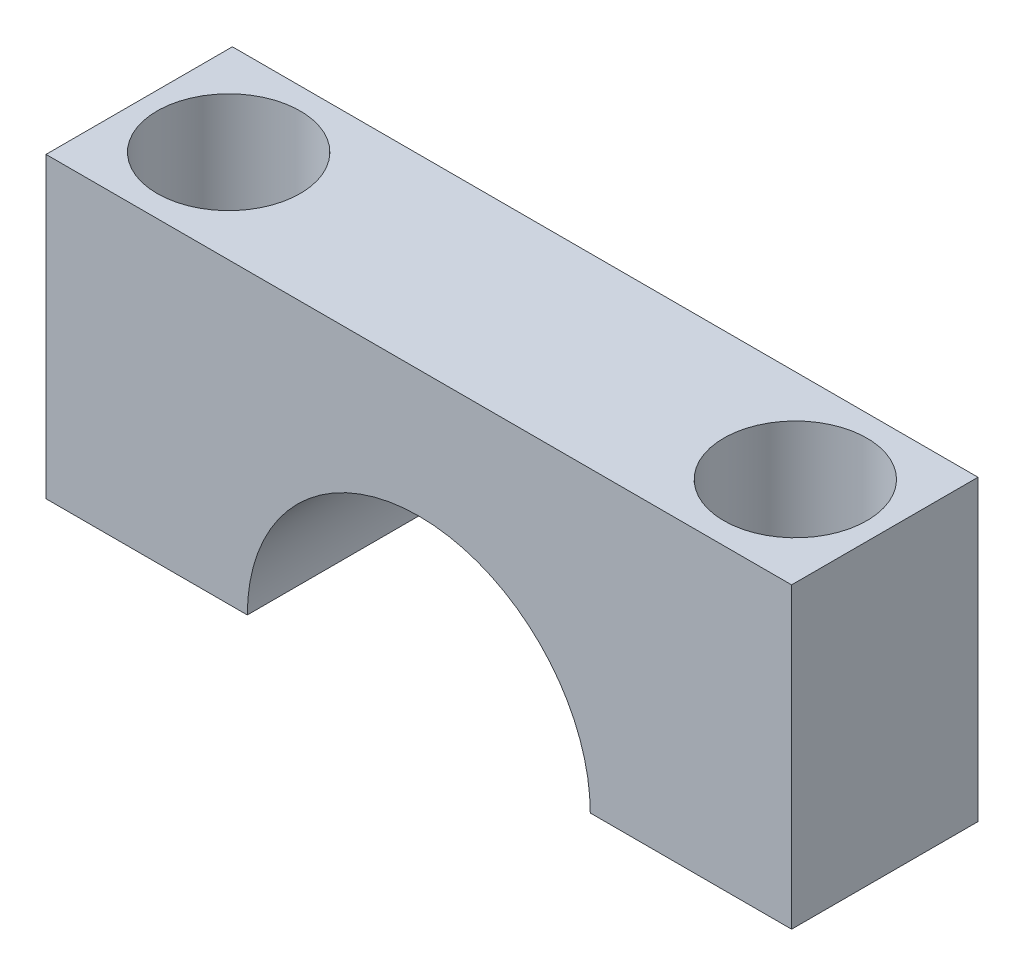
ISO-10303-21;
HEADER;
FILE_DESCRIPTION(('STEP AP214'),'2;1');
FILE_NAME('part.step','',(''),(''),'','','');
FILE_SCHEMA(('AUTOMOTIVE_DESIGN { 1 0 10303 214 1 1 1 1 }'));
ENDSEC;
DATA;
#1=APPLICATION_CONTEXT('core data for automotive mechanical design processes');
#2=APPLICATION_PROTOCOL_DEFINITION('international standard','automotive_design',2000,#1);
#3=PRODUCT_CONTEXT('',#1,'mechanical');
#4=PRODUCT('Part','Part','',(#3));
#5=PRODUCT_RELATED_PRODUCT_CATEGORY('part','',(#4));
#6=PRODUCT_DEFINITION_FORMATION('','',#4);
#7=PRODUCT_DEFINITION_CONTEXT('part definition',#1,'design');
#8=PRODUCT_DEFINITION('design','',#6,#7);
#9=PRODUCT_DEFINITION_SHAPE('','',#8);
#10=(LENGTH_UNIT() NAMED_UNIT(*) SI_UNIT(.MILLI.,.METRE.));
#11=(NAMED_UNIT(*) PLANE_ANGLE_UNIT() SI_UNIT($,.RADIAN.));
#12=(NAMED_UNIT(*) SI_UNIT($,.STERADIAN.) SOLID_ANGLE_UNIT());
#13=UNCERTAINTY_MEASURE_WITH_UNIT(LENGTH_MEASURE(1.E-05),#10,'distance_accuracy_value','');
#14=(GEOMETRIC_REPRESENTATION_CONTEXT(3) GLOBAL_UNCERTAINTY_ASSIGNED_CONTEXT((#13)) GLOBAL_UNIT_ASSIGNED_CONTEXT((#10,
#11,#12)) REPRESENTATION_CONTEXT('',''));
#15=CARTESIAN_POINT('',(0.,0.,0.));
#16=DIRECTION('',(0.,0.,1.));
#17=DIRECTION('',(1.,0.,0.));
#18=AXIS2_PLACEMENT_3D('',#15,#16,#17);
#19=CARTESIAN_POINT('',(6.35,0.,3.175));
#20=DIRECTION('',(0.,0.,-1.));
#21=DIRECTION('',(-1.,0.,0.));
#22=AXIS2_PLACEMENT_3D('',#19,#20,#21);
#23=CYLINDRICAL_SURFACE('',#22,2.921);
#24=CARTESIAN_POINT('',(6.35,0.,0.));
#25=DIRECTION('',(0.,0.,-1.));
#26=DIRECTION('',(1.,0.,0.));
#27=AXIS2_PLACEMENT_3D('',#24,#25,#26);
#28=CIRCLE('',#27,2.921);
#29=CARTESIAN_POINT('',(3.429,0.,0.));
#30=VERTEX_POINT('',#29);
#31=CARTESIAN_POINT('',(9.271,0.,0.));
#32=VERTEX_POINT('',#31);
#33=EDGE_CURVE('E121',#30,#32,#28,.T.);
#34=ORIENTED_EDGE('',*,*,#33,.T.);
#35=DIRECTION('',(0.,0.,-1.));
#36=VECTOR('',#35,1.);
#37=CARTESIAN_POINT('',(9.271,0.,3.175));
#38=LINE('',#37,#36);
#39=CARTESIAN_POINT('',(9.271,0.,3.175));
#40=VERTEX_POINT('',#39);
#41=EDGE_CURVE('E11',#40,#32,#38,.T.);
#42=ORIENTED_EDGE('',*,*,#41,.F.);
#43=CARTESIAN_POINT('',(6.35,0.,3.175));
#44=DIRECTION('',(0.,0.,-1.));
#45=DIRECTION('',(1.,0.,0.));
#46=AXIS2_PLACEMENT_3D('',#43,#44,#45);
#47=CIRCLE('',#46,2.921);
#48=CARTESIAN_POINT('',(3.429,0.,3.175));
#49=VERTEX_POINT('',#48);
#50=EDGE_CURVE('E132',#49,#40,#47,.T.);
#51=ORIENTED_EDGE('',*,*,#50,.F.);
#52=DIRECTION('',(0.,0.,-1.));
#53=VECTOR('',#52,1.);
#54=CARTESIAN_POINT('',(3.429,0.,3.175));
#55=LINE('',#54,#53);
#56=EDGE_CURVE('E117',#49,#30,#55,.T.);
#57=ORIENTED_EDGE('',*,*,#56,.T.);
#58=EDGE_LOOP('',(#34,#42,#51,#57));
#59=FACE_BOUND('',#58,.T.);
#60=ADVANCED_FACE('F37',(#59),#23,.F.);
#61=CARTESIAN_POINT('',(12.7,0.,3.175));
#62=DIRECTION('',(0.,1.,0.));
#63=DIRECTION('',(-1.,0.,0.));
#64=AXIS2_PLACEMENT_3D('',#61,#62,#63);
#65=PLANE('',#64);
#66=CARTESIAN_POINT('',(11.176,0.,1.5875));
#67=DIRECTION('',(0.,1.,0.));
#68=DIRECTION('',(0.,0.,1.));
#69=AXIS2_PLACEMENT_3D('',#66,#67,#68);
#70=CIRCLE('',#69,1.2192);
#71=CARTESIAN_POINT('',(11.176,0.,2.8067));
#72=VERTEX_POINT('',#71);
#73=EDGE_CURVE('E125',#72,#72,#70,.T.);
#74=ORIENTED_EDGE('',*,*,#73,.T.);
#75=EDGE_LOOP('',(#74));
#76=FACE_BOUND('',#75,.T.);
#77=DIRECTION('',(1.,0.,0.));
#78=VECTOR('',#77,1.);
#79=CARTESIAN_POINT('',(12.7,0.,0.));
#80=LINE('',#79,#78);
#81=CARTESIAN_POINT('',(12.7,0.,0.));
#82=VERTEX_POINT('',#81);
#83=EDGE_CURVE('E124',#32,#82,#80,.T.);
#84=ORIENTED_EDGE('',*,*,#83,.T.);
#85=DIRECTION('',(0.,0.,-1.));
#86=VECTOR('',#85,1.);
#87=CARTESIAN_POINT('',(12.7,0.,3.175));
#88=LINE('',#87,#86);
#89=CARTESIAN_POINT('',(12.7,0.,3.175));
#90=VERTEX_POINT('',#89);
#91=EDGE_CURVE('E45',#90,#82,#88,.T.);
#92=ORIENTED_EDGE('',*,*,#91,.F.);
#93=DIRECTION('',(1.,0.,0.));
#94=VECTOR('',#93,1.);
#95=CARTESIAN_POINT('',(12.7,0.,3.175));
#96=LINE('',#95,#94);
#97=EDGE_CURVE('E90',#40,#90,#96,.T.);
#98=ORIENTED_EDGE('',*,*,#97,.F.);
#99=ORIENTED_EDGE('',*,*,#41,.T.);
#100=EDGE_LOOP('',(#84,#92,#98,#99));
#101=FACE_BOUND('',#100,.T.);
#102=ADVANCED_FACE('F158',(#76,#101),#65,.F.);
#103=CARTESIAN_POINT('',(12.7,5.08,3.175));
#104=DIRECTION('',(-1.,0.,0.));
#105=DIRECTION('',(0.,0.,1.));
#106=AXIS2_PLACEMENT_3D('',#103,#104,#105);
#107=PLANE('',#106);
#108=DIRECTION('',(0.,1.,0.));
#109=VECTOR('',#108,1.);
#110=CARTESIAN_POINT('',(12.7,5.08,0.));
#111=LINE('',#110,#109);
#112=CARTESIAN_POINT('',(12.7,5.08,0.));
#113=VERTEX_POINT('',#112);
#114=EDGE_CURVE('E127',#82,#113,#111,.T.);
#115=ORIENTED_EDGE('',*,*,#114,.T.);
#116=DIRECTION('',(0.,0.,-1.));
#117=VECTOR('',#116,1.);
#118=CARTESIAN_POINT('',(12.7,5.08,3.175));
#119=LINE('',#118,#117);
#120=CARTESIAN_POINT('',(12.7,5.08,3.175));
#121=VERTEX_POINT('',#120);
#122=EDGE_CURVE('E112',#121,#113,#119,.T.);
#123=ORIENTED_EDGE('',*,*,#122,.F.);
#124=DIRECTION('',(0.,1.,0.));
#125=VECTOR('',#124,1.);
#126=CARTESIAN_POINT('',(12.7,5.08,3.175));
#127=LINE('',#126,#125);
#128=EDGE_CURVE('E103',#90,#121,#127,.T.);
#129=ORIENTED_EDGE('',*,*,#128,.F.);
#130=ORIENTED_EDGE('',*,*,#91,.T.);
#131=EDGE_LOOP('',(#115,#123,#129,#130));
#132=FACE_BOUND('',#131,.T.);
#133=ADVANCED_FACE('F138',(#132),#107,.F.);
#134=CARTESIAN_POINT('',(0.,5.08,3.175));
#135=DIRECTION('',(0.,-1.,0.));
#136=DIRECTION('',(1.,0.,0.));
#137=AXIS2_PLACEMENT_3D('',#134,#135,#136);
#138=PLANE('',#137);
#139=CARTESIAN_POINT('',(1.524,5.08,1.5875));
#140=DIRECTION('',(0.,1.,0.));
#141=DIRECTION('',(0.,0.,1.));
#142=AXIS2_PLACEMENT_3D('',#139,#140,#141);
#143=CIRCLE('',#142,1.2192);
#144=CARTESIAN_POINT('',(1.524,5.08,2.8067));
#145=VERTEX_POINT('',#144);
#146=EDGE_CURVE('E176',#145,#145,#143,.T.);
#147=ORIENTED_EDGE('',*,*,#146,.F.);
#148=EDGE_LOOP('',(#147));
#149=FACE_BOUND('',#148,.T.);
#150=CARTESIAN_POINT('',(11.176,5.08,1.5875));
#151=DIRECTION('',(0.,1.,0.));
#152=DIRECTION('',(0.,0.,1.));
#153=AXIS2_PLACEMENT_3D('',#150,#151,#152);
#154=CIRCLE('',#153,1.2192);
#155=CARTESIAN_POINT('',(11.176,5.08,2.8067));
#156=VERTEX_POINT('',#155);
#157=EDGE_CURVE('E179',#156,#156,#154,.T.);
#158=ORIENTED_EDGE('',*,*,#157,.F.);
#159=EDGE_LOOP('',(#158));
#160=FACE_BOUND('',#159,.T.);
#161=DIRECTION('',(-1.,0.,0.));
#162=VECTOR('',#161,1.);
#163=CARTESIAN_POINT('',(0.,5.08,0.));
#164=LINE('',#163,#162);
#165=CARTESIAN_POINT('',(0.,5.08,0.));
#166=VERTEX_POINT('',#165);
#167=EDGE_CURVE('E111',#113,#166,#164,.T.);
#168=ORIENTED_EDGE('',*,*,#167,.T.);
#169=DIRECTION('',(0.,0.,-1.));
#170=VECTOR('',#169,1.);
#171=CARTESIAN_POINT('',(0.,5.08,3.175));
#172=LINE('',#171,#170);
#173=CARTESIAN_POINT('',(0.,5.08,3.175));
#174=VERTEX_POINT('',#173);
#175=EDGE_CURVE('E108',#174,#166,#172,.T.);
#176=ORIENTED_EDGE('',*,*,#175,.F.);
#177=DIRECTION('',(-1.,0.,0.));
#178=VECTOR('',#177,1.);
#179=CARTESIAN_POINT('',(0.,5.08,3.175));
#180=LINE('',#179,#178);
#181=EDGE_CURVE('E97',#121,#174,#180,.T.);
#182=ORIENTED_EDGE('',*,*,#181,.F.);
#183=ORIENTED_EDGE('',*,*,#122,.T.);
#184=EDGE_LOOP('',(#168,#176,#182,#183));
#185=FACE_BOUND('',#184,.T.);
#186=ADVANCED_FACE('F109',(#149,#160,#185),#138,.F.);
#187=CARTESIAN_POINT('',(0.,0.,3.175));
#188=DIRECTION('',(1.,0.,0.));
#189=DIRECTION('',(0.,0.,-1.));
#190=AXIS2_PLACEMENT_3D('',#187,#188,#189);
#191=PLANE('',#190);
#192=DIRECTION('',(0.,-1.,0.));
#193=VECTOR('',#192,1.);
#194=CARTESIAN_POINT('',(0.,0.,0.));
#195=LINE('',#194,#193);
#196=CARTESIAN_POINT('',(0.,0.,0.));
#197=VERTEX_POINT('',#196);
#198=EDGE_CURVE('E76',#166,#197,#195,.T.);
#199=ORIENTED_EDGE('',*,*,#198,.T.);
#200=DIRECTION('',(0.,0.,-1.));
#201=VECTOR('',#200,1.);
#202=CARTESIAN_POINT('',(0.,0.,3.175));
#203=LINE('',#202,#201);
#204=CARTESIAN_POINT('',(0.,0.,3.175));
#205=VERTEX_POINT('',#204);
#206=EDGE_CURVE('E113',#205,#197,#203,.T.);
#207=ORIENTED_EDGE('',*,*,#206,.F.);
#208=DIRECTION('',(0.,-1.,0.));
#209=VECTOR('',#208,1.);
#210=CARTESIAN_POINT('',(0.,0.,3.175));
#211=LINE('',#210,#209);
#212=EDGE_CURVE('E101',#174,#205,#211,.T.);
#213=ORIENTED_EDGE('',*,*,#212,.F.);
#214=ORIENTED_EDGE('',*,*,#175,.T.);
#215=EDGE_LOOP('',(#199,#207,#213,#214));
#216=FACE_BOUND('',#215,.T.);
#217=ADVANCED_FACE('F115',(#216),#191,.F.);
#218=CARTESIAN_POINT('',(3.429,0.,3.175));
#219=DIRECTION('',(0.,1.,0.));
#220=DIRECTION('',(0.,0.,1.));
#221=AXIS2_PLACEMENT_3D('',#218,#219,#220);
#222=PLANE('',#221);
#223=CARTESIAN_POINT('',(1.524,0.,1.5875));
#224=DIRECTION('',(0.,1.,0.));
#225=DIRECTION('',(0.,0.,1.));
#226=AXIS2_PLACEMENT_3D('',#223,#224,#225);
#227=CIRCLE('',#226,1.2192);
#228=CARTESIAN_POINT('',(1.524,0.,2.8067));
#229=VERTEX_POINT('',#228);
#230=EDGE_CURVE('E181',#229,#229,#227,.T.);
#231=ORIENTED_EDGE('',*,*,#230,.T.);
#232=EDGE_LOOP('',(#231));
#233=FACE_BOUND('',#232,.T.);
#234=DIRECTION('',(1.,0.,0.));
#235=VECTOR('',#234,1.);
#236=CARTESIAN_POINT('',(3.429,0.,0.));
#237=LINE('',#236,#235);
#238=EDGE_CURVE('E82',#197,#30,#237,.T.);
#239=ORIENTED_EDGE('',*,*,#238,.T.);
#240=ORIENTED_EDGE('',*,*,#56,.F.);
#241=DIRECTION('',(1.,0.,0.));
#242=VECTOR('',#241,1.);
#243=CARTESIAN_POINT('',(3.429,0.,3.175));
#244=LINE('',#243,#242);
#245=EDGE_CURVE('E53',#205,#49,#244,.T.);
#246=ORIENTED_EDGE('',*,*,#245,.F.);
#247=ORIENTED_EDGE('',*,*,#206,.T.);
#248=EDGE_LOOP('',(#239,#240,#246,#247));
#249=FACE_BOUND('',#248,.T.);
#250=ADVANCED_FACE('F145',(#233,#249),#222,.F.);
#251=CARTESIAN_POINT('',(6.35,0.,3.175));
#252=DIRECTION('',(0.,0.,1.));
#253=DIRECTION('',(1.,0.,0.));
#254=AXIS2_PLACEMENT_3D('',#251,#252,#253);
#255=PLANE('',#254);
#256=ORIENTED_EDGE('',*,*,#50,.T.);
#257=ORIENTED_EDGE('',*,*,#97,.T.);
#258=ORIENTED_EDGE('',*,*,#128,.T.);
#259=ORIENTED_EDGE('',*,*,#181,.T.);
#260=ORIENTED_EDGE('',*,*,#212,.T.);
#261=ORIENTED_EDGE('',*,*,#245,.T.);
#262=EDGE_LOOP('',(#256,#257,#258,#259,#260,#261));
#263=FACE_BOUND('',#262,.T.);
#264=ADVANCED_FACE('F99',(#263),#255,.T.);
#265=CARTESIAN_POINT('',(6.35,0.,0.));
#266=DIRECTION('',(0.,0.,1.));
#267=DIRECTION('',(1.,0.,0.));
#268=AXIS2_PLACEMENT_3D('',#265,#266,#267);
#269=PLANE('',#268);
#270=ORIENTED_EDGE('',*,*,#33,.F.);
#271=ORIENTED_EDGE('',*,*,#238,.F.);
#272=ORIENTED_EDGE('',*,*,#198,.F.);
#273=ORIENTED_EDGE('',*,*,#167,.F.);
#274=ORIENTED_EDGE('',*,*,#114,.F.);
#275=ORIENTED_EDGE('',*,*,#83,.F.);
#276=EDGE_LOOP('',(#270,#271,#272,#273,#274,#275));
#277=FACE_BOUND('',#276,.T.);
#278=ADVANCED_FACE('F141',(#277),#269,.F.);
#279=CARTESIAN_POINT('',(11.176,5.08,1.5875));
#280=DIRECTION('',(0.,1.,0.));
#281=DIRECTION('',(0.,0.,1.));
#282=AXIS2_PLACEMENT_3D('',#279,#280,#281);
#283=CYLINDRICAL_SURFACE('',#282,1.2192);
#284=ORIENTED_EDGE('',*,*,#73,.F.);
#285=EDGE_LOOP('',(#284));
#286=FACE_BOUND('',#285,.T.);
#287=ORIENTED_EDGE('',*,*,#157,.T.);
#288=EDGE_LOOP('',(#287));
#289=FACE_BOUND('',#288,.T.);
#290=ADVANCED_FACE('F191',(#286,#289),#283,.F.);
#291=CARTESIAN_POINT('',(1.524,5.08,1.5875));
#292=DIRECTION('',(0.,1.,0.));
#293=DIRECTION('',(0.,0.,1.));
#294=AXIS2_PLACEMENT_3D('',#291,#292,#293);
#295=CYLINDRICAL_SURFACE('',#294,1.2192);
#296=ORIENTED_EDGE('',*,*,#230,.F.);
#297=EDGE_LOOP('',(#296));
#298=FACE_BOUND('',#297,.T.);
#299=ORIENTED_EDGE('',*,*,#146,.T.);
#300=EDGE_LOOP('',(#299));
#301=FACE_BOUND('',#300,.T.);
#302=ADVANCED_FACE('F189',(#298,#301),#295,.F.);
#303=CLOSED_SHELL('',(#60,#102,#133,#186,#217,#250,#264,#278,#290,#302));
#304=MANIFOLD_SOLID_BREP('B2',#303);
#305=ADVANCED_BREP_SHAPE_REPRESENTATION('',(#18,#304),#14);
#306=SHAPE_DEFINITION_REPRESENTATION(#9,#305);
ENDSEC;
END-ISO-10303-21;
